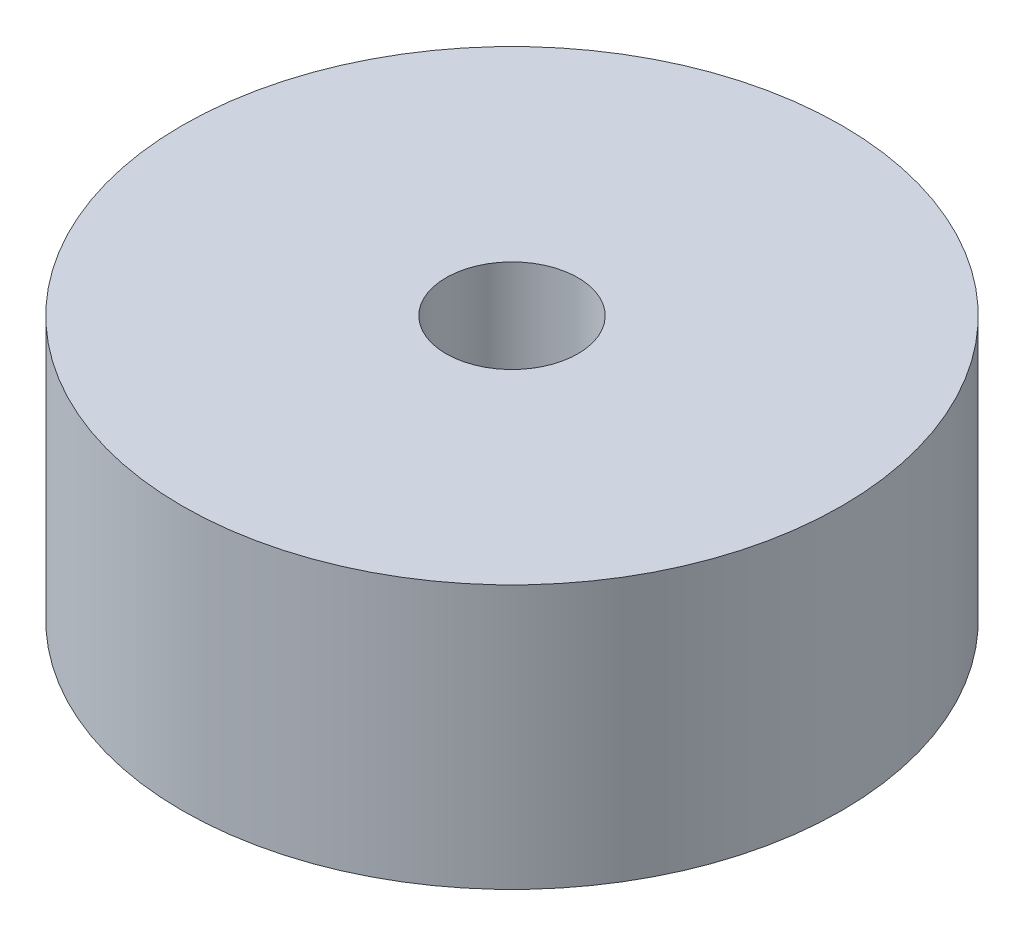
ISO-10303-21;
HEADER;
FILE_DESCRIPTION(('STEP AP214'),'2;1');
FILE_NAME('part.step','',(''),(''),'','','');
FILE_SCHEMA(('AUTOMOTIVE_DESIGN { 1 0 10303 214 1 1 1 1 }'));
ENDSEC;
DATA;
#1=APPLICATION_CONTEXT('core data for automotive mechanical design processes');
#2=APPLICATION_PROTOCOL_DEFINITION('international standard','automotive_design',2000,#1);
#3=PRODUCT_CONTEXT('',#1,'mechanical');
#4=PRODUCT('Part','Part','',(#3));
#5=PRODUCT_RELATED_PRODUCT_CATEGORY('part','',(#4));
#6=PRODUCT_DEFINITION_FORMATION('','',#4);
#7=PRODUCT_DEFINITION_CONTEXT('part definition',#1,'design');
#8=PRODUCT_DEFINITION('design','',#6,#7);
#9=PRODUCT_DEFINITION_SHAPE('','',#8);
#10=(LENGTH_UNIT() NAMED_UNIT(*) SI_UNIT(.MILLI.,.METRE.));
#11=(NAMED_UNIT(*) PLANE_ANGLE_UNIT() SI_UNIT($,.RADIAN.));
#12=(NAMED_UNIT(*) SI_UNIT($,.STERADIAN.) SOLID_ANGLE_UNIT());
#13=UNCERTAINTY_MEASURE_WITH_UNIT(LENGTH_MEASURE(1.E-05),#10,'distance_accuracy_value','');
#14=(GEOMETRIC_REPRESENTATION_CONTEXT(3) GLOBAL_UNCERTAINTY_ASSIGNED_CONTEXT((#13)) GLOBAL_UNIT_ASSIGNED_CONTEXT((#10,
#11,#12)) REPRESENTATION_CONTEXT('',''));
#15=CARTESIAN_POINT('',(0.,0.,0.));
#16=DIRECTION('',(0.,0.,1.));
#17=DIRECTION('',(1.,0.,0.));
#18=AXIS2_PLACEMENT_3D('',#15,#16,#17);
#19=CARTESIAN_POINT('',(0.,2.,0.));
#20=DIRECTION('',(0.,1.,0.));
#21=DIRECTION('',(0.,0.,1.));
#22=AXIS2_PLACEMENT_3D('',#19,#20,#21);
#23=PLANE('',#22);
#24=CARTESIAN_POINT('',(0.,2.,0.));
#25=DIRECTION('',(0.,1.,0.));
#26=DIRECTION('',(1.,0.,0.));
#27=AXIS2_PLACEMENT_3D('',#24,#25,#26);
#28=CIRCLE('',#27,2.5);
#29=CARTESIAN_POINT('',(2.5,2.,0.));
#30=VERTEX_POINT('',#29);
#31=EDGE_CURVE('E11',#30,#30,#28,.T.);
#32=ORIENTED_EDGE('',*,*,#31,.T.);
#33=EDGE_LOOP('',(#32));
#34=FACE_BOUND('',#33,.T.);
#35=CARTESIAN_POINT('',(0.,2.,0.));
#36=DIRECTION('',(0.,1.,0.));
#37=DIRECTION('',(0.,0.,1.));
#38=AXIS2_PLACEMENT_3D('',#35,#36,#37);
#39=CIRCLE('',#38,0.5);
#40=CARTESIAN_POINT('',(0.,2.,0.5));
#41=VERTEX_POINT('',#40);
#42=EDGE_CURVE('E48',#41,#41,#39,.T.);
#43=ORIENTED_EDGE('',*,*,#42,.F.);
#44=EDGE_LOOP('',(#43));
#45=FACE_BOUND('',#44,.T.);
#46=ADVANCED_FACE('F37',(#34,#45),#23,.T.);
#47=CARTESIAN_POINT('',(0.,0.,0.));
#48=DIRECTION('',(0.,1.,0.));
#49=DIRECTION('',(0.,0.,1.));
#50=AXIS2_PLACEMENT_3D('',#47,#48,#49);
#51=PLANE('',#50);
#52=CARTESIAN_POINT('',(0.,0.,0.));
#53=DIRECTION('',(0.,1.,0.));
#54=DIRECTION('',(1.,0.,0.));
#55=AXIS2_PLACEMENT_3D('',#52,#53,#54);
#56=CIRCLE('',#55,2.5);
#57=CARTESIAN_POINT('',(2.5,0.,0.));
#58=VERTEX_POINT('',#57);
#59=EDGE_CURVE('E41',#58,#58,#56,.T.);
#60=ORIENTED_EDGE('',*,*,#59,.F.);
#61=EDGE_LOOP('',(#60));
#62=FACE_BOUND('',#61,.T.);
#63=CARTESIAN_POINT('',(0.,0.,0.));
#64=DIRECTION('',(0.,1.,0.));
#65=DIRECTION('',(0.,0.,1.));
#66=AXIS2_PLACEMENT_3D('',#63,#64,#65);
#67=CIRCLE('',#66,0.5);
#68=CARTESIAN_POINT('',(0.,0.,0.5));
#69=VERTEX_POINT('',#68);
#70=EDGE_CURVE('E50',#69,#69,#67,.T.);
#71=ORIENTED_EDGE('',*,*,#70,.T.);
#72=EDGE_LOOP('',(#71));
#73=FACE_BOUND('',#72,.T.);
#74=ADVANCED_FACE('F60',(#62,#73),#51,.F.);
#75=CARTESIAN_POINT('',(0.,2.,0.));
#76=DIRECTION('',(0.,-1.,0.));
#77=DIRECTION('',(0.,0.,-1.));
#78=AXIS2_PLACEMENT_3D('',#75,#76,#77);
#79=CYLINDRICAL_SURFACE('',#78,2.5);
#80=ORIENTED_EDGE('',*,*,#31,.F.);
#81=EDGE_LOOP('',(#80));
#82=FACE_BOUND('',#81,.T.);
#83=ORIENTED_EDGE('',*,*,#59,.T.);
#84=EDGE_LOOP('',(#83));
#85=FACE_BOUND('',#84,.T.);
#86=ADVANCED_FACE('F39',(#82,#85),#79,.T.);
#87=CARTESIAN_POINT('',(0.,2.,0.));
#88=DIRECTION('',(0.,-1.,0.));
#89=DIRECTION('',(0.,0.,-1.));
#90=AXIS2_PLACEMENT_3D('',#87,#88,#89);
#91=CYLINDRICAL_SURFACE('',#90,0.5);
#92=ORIENTED_EDGE('',*,*,#42,.T.);
#93=EDGE_LOOP('',(#92));
#94=FACE_BOUND('',#93,.T.);
#95=ORIENTED_EDGE('',*,*,#70,.F.);
#96=EDGE_LOOP('',(#95));
#97=FACE_BOUND('',#96,.T.);
#98=ADVANCED_FACE('F56',(#94,#97),#91,.F.);
#99=CLOSED_SHELL('',(#46,#74,#86,#98));
#100=MANIFOLD_SOLID_BREP('B2',#99);
#101=ADVANCED_BREP_SHAPE_REPRESENTATION('',(#18,#100),#14);
#102=SHAPE_DEFINITION_REPRESENTATION(#9,#101);
ENDSEC;
END-ISO-10303-21;
